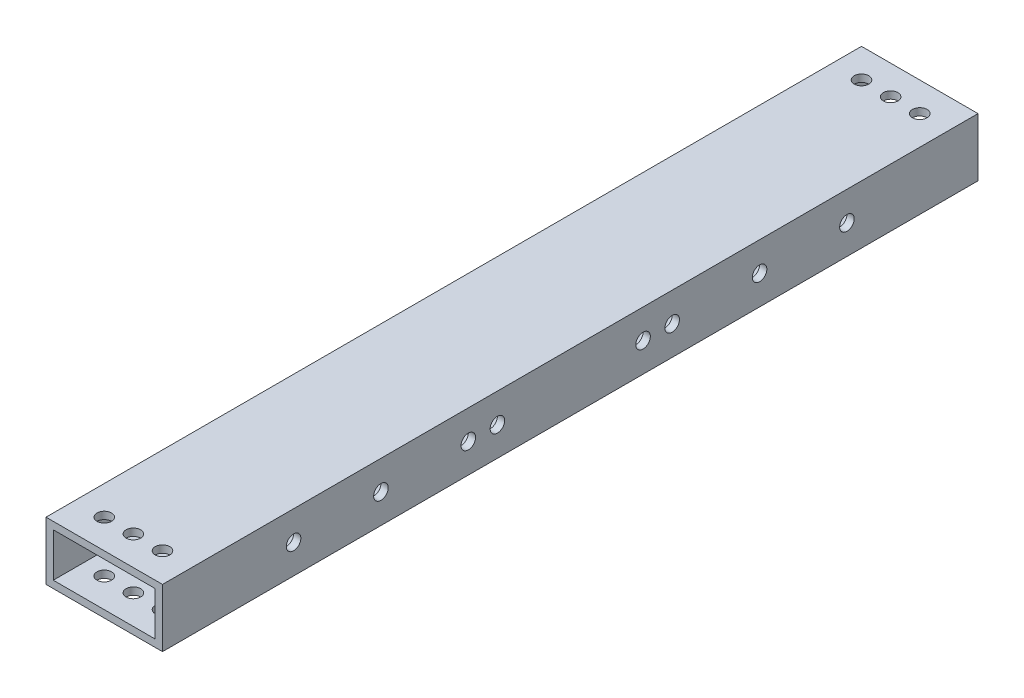
ISO-10303-21;
HEADER;
FILE_DESCRIPTION(('STEP AP214'),'2;1');
FILE_NAME('part.step','',(''),(''),'','','');
FILE_SCHEMA(('AUTOMOTIVE_DESIGN { 1 0 10303 214 1 1 1 1 }'));
ENDSEC;
DATA;
#1=APPLICATION_CONTEXT('core data for automotive mechanical design processes');
#2=APPLICATION_PROTOCOL_DEFINITION('international standard','automotive_design',2000,#1);
#3=PRODUCT_CONTEXT('',#1,'mechanical');
#4=PRODUCT('Part','Part','',(#3));
#5=PRODUCT_RELATED_PRODUCT_CATEGORY('part','',(#4));
#6=PRODUCT_DEFINITION_FORMATION('','',#4);
#7=PRODUCT_DEFINITION_CONTEXT('part definition',#1,'design');
#8=PRODUCT_DEFINITION('design','',#6,#7);
#9=PRODUCT_DEFINITION_SHAPE('','',#8);
#10=(LENGTH_UNIT() NAMED_UNIT(*) SI_UNIT(.MILLI.,.METRE.));
#11=(NAMED_UNIT(*) PLANE_ANGLE_UNIT() SI_UNIT($,.RADIAN.));
#12=(NAMED_UNIT(*) SI_UNIT($,.STERADIAN.) SOLID_ANGLE_UNIT());
#13=UNCERTAINTY_MEASURE_WITH_UNIT(LENGTH_MEASURE(1.E-05),#10,'distance_accuracy_value','');
#14=(GEOMETRIC_REPRESENTATION_CONTEXT(3) GLOBAL_UNCERTAINTY_ASSIGNED_CONTEXT((#13)) GLOBAL_UNIT_ASSIGNED_CONTEXT((#10,
#11,#12)) REPRESENTATION_CONTEXT('',''));
#15=CARTESIAN_POINT('',(0.,0.,0.));
#16=DIRECTION('',(0.,0.,1.));
#17=DIRECTION('',(1.,0.,0.));
#18=AXIS2_PLACEMENT_3D('',#15,#16,#17);
#19=CARTESIAN_POINT('',(0.,0.,355.6));
#20=DIRECTION('',(0.,0.,-1.));
#21=DIRECTION('',(-1.,0.,0.));
#22=AXIS2_PLACEMENT_3D('',#19,#20,#21);
#23=PLANE('',#22);
#24=DIRECTION('',(0.,-1.,0.));
#25=VECTOR('',#24,1.);
#26=CARTESIAN_POINT('',(0.,0.,355.6));
#27=LINE('',#26,#25);
#28=CARTESIAN_POINT('',(0.,25.4,355.6));
#29=VERTEX_POINT('',#28);
#30=CARTESIAN_POINT('',(0.,0.,355.6));
#31=VERTEX_POINT('',#30);
#32=EDGE_CURVE('E144',#29,#31,#27,.T.);
#33=ORIENTED_EDGE('',*,*,#32,.T.);
#34=DIRECTION('',(1.,0.,0.));
#35=VECTOR('',#34,1.);
#36=CARTESIAN_POINT('',(0.,0.,355.6));
#37=LINE('',#36,#35);
#38=CARTESIAN_POINT('',(50.8,0.,355.6));
#39=VERTEX_POINT('',#38);
#40=EDGE_CURVE('E147',#31,#39,#37,.T.);
#41=ORIENTED_EDGE('',*,*,#40,.T.);
#42=DIRECTION('',(0.,1.,0.));
#43=VECTOR('',#42,1.);
#44=CARTESIAN_POINT('',(50.8,0.,355.6));
#45=LINE('',#44,#43);
#46=CARTESIAN_POINT('',(50.8,25.4,355.6));
#47=VERTEX_POINT('',#46);
#48=EDGE_CURVE('E150',#39,#47,#45,.T.);
#49=ORIENTED_EDGE('',*,*,#48,.T.);
#50=DIRECTION('',(-1.,0.,0.));
#51=VECTOR('',#50,1.);
#52=CARTESIAN_POINT('',(0.,25.4,355.6));
#53=LINE('',#52,#51);
#54=EDGE_CURVE('E152',#47,#29,#53,.T.);
#55=ORIENTED_EDGE('',*,*,#54,.T.);
#56=EDGE_LOOP('',(#33,#41,#49,#55));
#57=FACE_BOUND('',#56,.T.);
#58=DIRECTION('',(0.,-1.,0.));
#59=VECTOR('',#58,1.);
#60=CARTESIAN_POINT('',(3.175,3.175,355.6));
#61=LINE('',#60,#59);
#62=CARTESIAN_POINT('',(3.175,22.225,355.6));
#63=VERTEX_POINT('',#62);
#64=CARTESIAN_POINT('',(3.175,3.175,355.6));
#65=VERTEX_POINT('',#64);
#66=EDGE_CURVE('E106',#63,#65,#61,.T.);
#67=ORIENTED_EDGE('',*,*,#66,.F.);
#68=DIRECTION('',(-1.,0.,0.));
#69=VECTOR('',#68,1.);
#70=CARTESIAN_POINT('',(3.175,22.225,355.6));
#71=LINE('',#70,#69);
#72=CARTESIAN_POINT('',(47.625,22.225,355.6));
#73=VERTEX_POINT('',#72);
#74=EDGE_CURVE('E128',#73,#63,#71,.T.);
#75=ORIENTED_EDGE('',*,*,#74,.F.);
#76=DIRECTION('',(0.,1.,0.));
#77=VECTOR('',#76,1.);
#78=CARTESIAN_POINT('',(47.625,3.175,355.6));
#79=LINE('',#78,#77);
#80=CARTESIAN_POINT('',(47.625,3.175,355.6));
#81=VERTEX_POINT('',#80);
#82=EDGE_CURVE('E126',#81,#73,#79,.T.);
#83=ORIENTED_EDGE('',*,*,#82,.F.);
#84=DIRECTION('',(1.,0.,0.));
#85=VECTOR('',#84,1.);
#86=CARTESIAN_POINT('',(3.175,3.175,355.6));
#87=LINE('',#86,#85);
#88=EDGE_CURVE('E114',#65,#81,#87,.T.);
#89=ORIENTED_EDGE('',*,*,#88,.F.);
#90=EDGE_LOOP('',(#67,#75,#83,#89));
#91=FACE_BOUND('',#90,.T.);
#92=ADVANCED_FACE('F39',(#57,#91),#23,.F.);
#93=CARTESIAN_POINT('',(0.,0.,0.));
#94=DIRECTION('',(0.,0.,-1.));
#95=DIRECTION('',(-1.,0.,0.));
#96=AXIS2_PLACEMENT_3D('',#93,#94,#95);
#97=PLANE('',#96);
#98=DIRECTION('',(0.,-1.,0.));
#99=VECTOR('',#98,1.);
#100=CARTESIAN_POINT('',(0.,0.,0.));
#101=LINE('',#100,#99);
#102=CARTESIAN_POINT('',(0.,25.4,0.));
#103=VERTEX_POINT('',#102);
#104=CARTESIAN_POINT('',(0.,0.,0.));
#105=VERTEX_POINT('',#104);
#106=EDGE_CURVE('E122',#103,#105,#101,.T.);
#107=ORIENTED_EDGE('',*,*,#106,.F.);
#108=DIRECTION('',(-1.,0.,0.));
#109=VECTOR('',#108,1.);
#110=CARTESIAN_POINT('',(0.,25.4,0.));
#111=LINE('',#110,#109);
#112=CARTESIAN_POINT('',(50.8,25.4,0.));
#113=VERTEX_POINT('',#112);
#114=EDGE_CURVE('E148',#113,#103,#111,.T.);
#115=ORIENTED_EDGE('',*,*,#114,.F.);
#116=DIRECTION('',(0.,1.,0.));
#117=VECTOR('',#116,1.);
#118=CARTESIAN_POINT('',(50.8,0.,0.));
#119=LINE('',#118,#117);
#120=CARTESIAN_POINT('',(50.8,0.,0.));
#121=VERTEX_POINT('',#120);
#122=EDGE_CURVE('E159',#121,#113,#119,.T.);
#123=ORIENTED_EDGE('',*,*,#122,.F.);
#124=DIRECTION('',(1.,0.,0.));
#125=VECTOR('',#124,1.);
#126=CARTESIAN_POINT('',(0.,0.,0.));
#127=LINE('',#126,#125);
#128=EDGE_CURVE('E157',#105,#121,#127,.T.);
#129=ORIENTED_EDGE('',*,*,#128,.F.);
#130=EDGE_LOOP('',(#107,#115,#123,#129));
#131=FACE_BOUND('',#130,.T.);
#132=DIRECTION('',(-1.,0.,0.));
#133=VECTOR('',#132,1.);
#134=CARTESIAN_POINT('',(3.175,22.225,0.));
#135=LINE('',#134,#133);
#136=CARTESIAN_POINT('',(47.625,22.225,0.));
#137=VERTEX_POINT('',#136);
#138=CARTESIAN_POINT('',(3.175,22.225,0.));
#139=VERTEX_POINT('',#138);
#140=EDGE_CURVE('E115',#137,#139,#135,.T.);
#141=ORIENTED_EDGE('',*,*,#140,.T.);
#142=DIRECTION('',(0.,-1.,0.));
#143=VECTOR('',#142,1.);
#144=CARTESIAN_POINT('',(3.175,3.175,0.));
#145=LINE('',#144,#143);
#146=CARTESIAN_POINT('',(3.175,3.175,0.));
#147=VERTEX_POINT('',#146);
#148=EDGE_CURVE('E64',#139,#147,#145,.T.);
#149=ORIENTED_EDGE('',*,*,#148,.T.);
#150=DIRECTION('',(1.,0.,0.));
#151=VECTOR('',#150,1.);
#152=CARTESIAN_POINT('',(3.175,3.175,0.));
#153=LINE('',#152,#151);
#154=CARTESIAN_POINT('',(47.625,3.175,0.));
#155=VERTEX_POINT('',#154);
#156=EDGE_CURVE('E121',#147,#155,#153,.T.);
#157=ORIENTED_EDGE('',*,*,#156,.T.);
#158=DIRECTION('',(0.,1.,0.));
#159=VECTOR('',#158,1.);
#160=CARTESIAN_POINT('',(47.625,3.175,0.));
#161=LINE('',#160,#159);
#162=EDGE_CURVE('E136',#155,#137,#161,.T.);
#163=ORIENTED_EDGE('',*,*,#162,.T.);
#164=EDGE_LOOP('',(#141,#149,#157,#163));
#165=FACE_BOUND('',#164,.T.);
#166=ADVANCED_FACE('F355',(#131,#165),#97,.T.);
#167=CARTESIAN_POINT('',(0.,0.,355.6));
#168=DIRECTION('',(1.,0.,0.));
#169=DIRECTION('',(0.,0.,-1.));
#170=AXIS2_PLACEMENT_3D('',#167,#168,#169);
#171=PLANE('',#170);
#172=CARTESIAN_POINT('',(0.,12.7000000000001,298.45));
#173=DIRECTION('',(1.,0.,0.));
#174=DIRECTION('',(0.,0.,-1.));
#175=AXIS2_PLACEMENT_3D('',#172,#173,#174);
#176=CIRCLE('',#175,3.17500000000003);
#177=CARTESIAN_POINT('',(0.,12.7000000000001,295.275));
#178=VERTEX_POINT('',#177);
#179=EDGE_CURVE('E134',#178,#178,#176,.T.);
#180=ORIENTED_EDGE('',*,*,#179,.T.);
#181=EDGE_LOOP('',(#180));
#182=FACE_BOUND('',#181,.T.);
#183=CARTESIAN_POINT('',(0.,12.7000000000001,260.35));
#184=DIRECTION('',(1.,0.,0.));
#185=DIRECTION('',(0.,0.,-1.));
#186=AXIS2_PLACEMENT_3D('',#183,#184,#185);
#187=CIRCLE('',#186,3.17499999999997);
#188=CARTESIAN_POINT('',(0.,12.7000000000001,257.175));
#189=VERTEX_POINT('',#188);
#190=EDGE_CURVE('E208',#189,#189,#187,.T.);
#191=ORIENTED_EDGE('',*,*,#190,.T.);
#192=EDGE_LOOP('',(#191));
#193=FACE_BOUND('',#192,.T.);
#194=CARTESIAN_POINT('',(0.,12.7000000000001,222.25));
#195=DIRECTION('',(1.,0.,0.));
#196=DIRECTION('',(0.,0.,-1.));
#197=AXIS2_PLACEMENT_3D('',#194,#195,#196);
#198=CIRCLE('',#197,3.175);
#199=CARTESIAN_POINT('',(0.,12.7000000000001,219.075));
#200=VERTEX_POINT('',#199);
#201=EDGE_CURVE('E203',#200,#200,#198,.T.);
#202=ORIENTED_EDGE('',*,*,#201,.T.);
#203=EDGE_LOOP('',(#202));
#204=FACE_BOUND('',#203,.T.);
#205=CARTESIAN_POINT('',(0.,12.7000000000001,146.05));
#206=DIRECTION('',(1.,0.,0.));
#207=DIRECTION('',(0.,0.,-1.));
#208=AXIS2_PLACEMENT_3D('',#205,#206,#207);
#209=CIRCLE('',#208,3.175);
#210=CARTESIAN_POINT('',(0.,12.7000000000001,142.875));
#211=VERTEX_POINT('',#210);
#212=EDGE_CURVE('E198',#211,#211,#209,.T.);
#213=ORIENTED_EDGE('',*,*,#212,.T.);
#214=EDGE_LOOP('',(#213));
#215=FACE_BOUND('',#214,.T.);
#216=CARTESIAN_POINT('',(0.,12.7000000000001,95.25));
#217=DIRECTION('',(1.,0.,0.));
#218=DIRECTION('',(0.,0.,-1.));
#219=AXIS2_PLACEMENT_3D('',#216,#217,#218);
#220=CIRCLE('',#219,3.175);
#221=CARTESIAN_POINT('',(0.,12.7000000000001,92.075));
#222=VERTEX_POINT('',#221);
#223=EDGE_CURVE('E193',#222,#222,#220,.T.);
#224=ORIENTED_EDGE('',*,*,#223,.T.);
#225=EDGE_LOOP('',(#224));
#226=FACE_BOUND('',#225,.T.);
#227=CARTESIAN_POINT('',(0.,12.7000000000001,57.15));
#228=DIRECTION('',(1.,0.,0.));
#229=DIRECTION('',(0.,0.,-1.));
#230=AXIS2_PLACEMENT_3D('',#227,#228,#229);
#231=CIRCLE('',#230,3.175);
#232=CARTESIAN_POINT('',(0.,12.7000000000001,53.975));
#233=VERTEX_POINT('',#232);
#234=EDGE_CURVE('E188',#233,#233,#231,.T.);
#235=ORIENTED_EDGE('',*,*,#234,.T.);
#236=EDGE_LOOP('',(#235));
#237=FACE_BOUND('',#236,.T.);
#238=CARTESIAN_POINT('',(0.,12.7000000000001,209.55));
#239=DIRECTION('',(1.,0.,0.));
#240=DIRECTION('',(0.,0.,-1.));
#241=AXIS2_PLACEMENT_3D('',#238,#239,#240);
#242=CIRCLE('',#241,3.17500000000003);
#243=CARTESIAN_POINT('',(0.,12.7000000000001,206.375));
#244=VERTEX_POINT('',#243);
#245=EDGE_CURVE('E183',#244,#244,#242,.T.);
#246=ORIENTED_EDGE('',*,*,#245,.T.);
#247=EDGE_LOOP('',(#246));
#248=FACE_BOUND('',#247,.T.);
#249=CARTESIAN_POINT('',(0.,12.7000000000001,133.35));
#250=DIRECTION('',(1.,0.,0.));
#251=DIRECTION('',(0.,0.,-1.));
#252=AXIS2_PLACEMENT_3D('',#249,#250,#251);
#253=CIRCLE('',#252,3.175);
#254=CARTESIAN_POINT('',(0.,12.7000000000001,130.175));
#255=VERTEX_POINT('',#254);
#256=EDGE_CURVE('E178',#255,#255,#253,.T.);
#257=ORIENTED_EDGE('',*,*,#256,.T.);
#258=EDGE_LOOP('',(#257));
#259=FACE_BOUND('',#258,.T.);
#260=ORIENTED_EDGE('',*,*,#106,.T.);
#261=DIRECTION('',(0.,0.,-1.));
#262=VECTOR('',#261,1.);
#263=CARTESIAN_POINT('',(0.,0.,355.6));
#264=LINE('',#263,#262);
#265=EDGE_CURVE('E11',#31,#105,#264,.T.);
#266=ORIENTED_EDGE('',*,*,#265,.F.);
#267=ORIENTED_EDGE('',*,*,#32,.F.);
#268=DIRECTION('',(0.,0.,-1.));
#269=VECTOR('',#268,1.);
#270=CARTESIAN_POINT('',(0.,25.4,355.6));
#271=LINE('',#270,#269);
#272=EDGE_CURVE('E154',#29,#103,#271,.T.);
#273=ORIENTED_EDGE('',*,*,#272,.T.);
#274=EDGE_LOOP('',(#260,#266,#267,#273));
#275=FACE_BOUND('',#274,.T.);
#276=ADVANCED_FACE('F41',(#182,#193,#204,#215,#226,#237,#248,#259,#275),#171,.F.);
#277=CARTESIAN_POINT('',(0.,0.,355.6));
#278=DIRECTION('',(0.,1.,0.));
#279=DIRECTION('',(0.,0.,1.));
#280=AXIS2_PLACEMENT_3D('',#277,#278,#279);
#281=PLANE('',#280);
#282=CARTESIAN_POINT('',(12.7,0.,12.7));
#283=DIRECTION('',(0.,1.,0.));
#284=DIRECTION('',(0.,0.,1.));
#285=AXIS2_PLACEMENT_3D('',#282,#283,#284);
#286=CIRCLE('',#285,3.17499999999998);
#287=CARTESIAN_POINT('',(12.7,0.,15.875));
#288=VERTEX_POINT('',#287);
#289=EDGE_CURVE('E380',#288,#288,#286,.T.);
#290=ORIENTED_EDGE('',*,*,#289,.T.);
#291=EDGE_LOOP('',(#290));
#292=FACE_BOUND('',#291,.T.);
#293=CARTESIAN_POINT('',(25.4,0.,12.7));
#294=DIRECTION('',(0.,1.,0.));
#295=DIRECTION('',(0.,0.,1.));
#296=AXIS2_PLACEMENT_3D('',#293,#294,#295);
#297=CIRCLE('',#296,3.17499999999999);
#298=CARTESIAN_POINT('',(25.4,0.,15.875));
#299=VERTEX_POINT('',#298);
#300=EDGE_CURVE('E231',#299,#299,#297,.T.);
#301=ORIENTED_EDGE('',*,*,#300,.T.);
#302=EDGE_LOOP('',(#301));
#303=FACE_BOUND('',#302,.T.);
#304=CARTESIAN_POINT('',(38.1,0.,12.7));
#305=DIRECTION('',(0.,1.,0.));
#306=DIRECTION('',(0.,0.,1.));
#307=AXIS2_PLACEMENT_3D('',#304,#305,#306);
#308=CIRCLE('',#307,3.17499999999998);
#309=CARTESIAN_POINT('',(38.1,0.,15.875));
#310=VERTEX_POINT('',#309);
#311=EDGE_CURVE('E227',#310,#310,#308,.T.);
#312=ORIENTED_EDGE('',*,*,#311,.T.);
#313=EDGE_LOOP('',(#312));
#314=FACE_BOUND('',#313,.T.);
#315=CARTESIAN_POINT('',(12.7000000000001,0.,342.9));
#316=DIRECTION('',(0.,1.,0.));
#317=DIRECTION('',(0.,0.,1.));
#318=AXIS2_PLACEMENT_3D('',#315,#316,#317);
#319=CIRCLE('',#318,3.17499999999999);
#320=CARTESIAN_POINT('',(12.7000000000001,0.,346.075));
#321=VERTEX_POINT('',#320);
#322=EDGE_CURVE('E223',#321,#321,#319,.T.);
#323=ORIENTED_EDGE('',*,*,#322,.T.);
#324=EDGE_LOOP('',(#323));
#325=FACE_BOUND('',#324,.T.);
#326=CARTESIAN_POINT('',(25.4000000000001,0.,342.9));
#327=DIRECTION('',(0.,1.,0.));
#328=DIRECTION('',(0.,0.,1.));
#329=AXIS2_PLACEMENT_3D('',#326,#327,#328);
#330=CIRCLE('',#329,3.17499999999998);
#331=CARTESIAN_POINT('',(25.4000000000001,0.,346.075));
#332=VERTEX_POINT('',#331);
#333=EDGE_CURVE('E218',#332,#332,#330,.T.);
#334=ORIENTED_EDGE('',*,*,#333,.T.);
#335=EDGE_LOOP('',(#334));
#336=FACE_BOUND('',#335,.T.);
#337=CARTESIAN_POINT('',(38.1000000000001,0.,342.9));
#338=DIRECTION('',(0.,1.,0.));
#339=DIRECTION('',(0.,0.,1.));
#340=AXIS2_PLACEMENT_3D('',#337,#338,#339);
#341=CIRCLE('',#340,3.17499999999998);
#342=CARTESIAN_POINT('',(38.1000000000001,0.,346.075));
#343=VERTEX_POINT('',#342);
#344=EDGE_CURVE('E213',#343,#343,#341,.T.);
#345=ORIENTED_EDGE('',*,*,#344,.T.);
#346=EDGE_LOOP('',(#345));
#347=FACE_BOUND('',#346,.T.);
#348=ORIENTED_EDGE('',*,*,#128,.T.);
#349=DIRECTION('',(0.,0.,-1.));
#350=VECTOR('',#349,1.);
#351=CARTESIAN_POINT('',(50.8,0.,355.6));
#352=LINE('',#351,#350);
#353=EDGE_CURVE('E48',#39,#121,#352,.T.);
#354=ORIENTED_EDGE('',*,*,#353,.F.);
#355=ORIENTED_EDGE('',*,*,#40,.F.);
#356=ORIENTED_EDGE('',*,*,#265,.T.);
#357=EDGE_LOOP('',(#348,#354,#355,#356));
#358=FACE_BOUND('',#357,.T.);
#359=ADVANCED_FACE('F372',(#292,#303,#314,#325,#336,#347,#358),#281,.F.);
#360=CARTESIAN_POINT('',(50.8,0.,355.6));
#361=DIRECTION('',(-1.,0.,0.));
#362=DIRECTION('',(0.,0.,1.));
#363=AXIS2_PLACEMENT_3D('',#360,#361,#362);
#364=PLANE('',#363);
#365=CARTESIAN_POINT('',(50.8,12.7000000000001,298.45));
#366=DIRECTION('',(-1.,0.,0.));
#367=DIRECTION('',(0.,0.,-1.));
#368=AXIS2_PLACEMENT_3D('',#365,#366,#367);
#369=CIRCLE('',#368,3.17500000000003);
#370=CARTESIAN_POINT('',(50.8,12.7000000000001,295.275));
#371=VERTEX_POINT('',#370);
#372=EDGE_CURVE('E274',#371,#371,#369,.T.);
#373=ORIENTED_EDGE('',*,*,#372,.T.);
#374=EDGE_LOOP('',(#373));
#375=FACE_BOUND('',#374,.T.);
#376=CARTESIAN_POINT('',(50.8,12.7000000000001,260.35));
#377=DIRECTION('',(-1.,0.,0.));
#378=DIRECTION('',(0.,0.,-1.));
#379=AXIS2_PLACEMENT_3D('',#376,#377,#378);
#380=CIRCLE('',#379,3.17499999999997);
#381=CARTESIAN_POINT('',(50.8,12.7000000000001,257.175));
#382=VERTEX_POINT('',#381);
#383=EDGE_CURVE('E290',#382,#382,#380,.T.);
#384=ORIENTED_EDGE('',*,*,#383,.T.);
#385=EDGE_LOOP('',(#384));
#386=FACE_BOUND('',#385,.T.);
#387=CARTESIAN_POINT('',(50.8,12.7000000000001,222.25));
#388=DIRECTION('',(-1.,0.,0.));
#389=DIRECTION('',(0.,0.,-1.));
#390=AXIS2_PLACEMENT_3D('',#387,#388,#389);
#391=CIRCLE('',#390,3.175);
#392=CARTESIAN_POINT('',(50.8,12.7000000000001,219.075));
#393=VERTEX_POINT('',#392);
#394=EDGE_CURVE('E282',#393,#393,#391,.T.);
#395=ORIENTED_EDGE('',*,*,#394,.T.);
#396=EDGE_LOOP('',(#395));
#397=FACE_BOUND('',#396,.T.);
#398=CARTESIAN_POINT('',(50.8,12.7000000000001,146.05));
#399=DIRECTION('',(-1.,0.,0.));
#400=DIRECTION('',(0.,0.,1.));
#401=AXIS2_PLACEMENT_3D('',#398,#399,#400);
#402=CIRCLE('',#401,3.175);
#403=CARTESIAN_POINT('',(50.8,12.7000000000001,149.225));
#404=VERTEX_POINT('',#403);
#405=EDGE_CURVE('E283',#404,#404,#402,.T.);
#406=ORIENTED_EDGE('',*,*,#405,.T.);
#407=EDGE_LOOP('',(#406));
#408=FACE_BOUND('',#407,.T.);
#409=CARTESIAN_POINT('',(50.8,12.7000000000001,95.25));
#410=DIRECTION('',(-1.,0.,0.));
#411=DIRECTION('',(0.,0.,1.));
#412=AXIS2_PLACEMENT_3D('',#409,#410,#411);
#413=CIRCLE('',#412,3.175);
#414=CARTESIAN_POINT('',(50.8,12.7000000000001,98.425));
#415=VERTEX_POINT('',#414);
#416=EDGE_CURVE('E278',#415,#415,#413,.T.);
#417=ORIENTED_EDGE('',*,*,#416,.T.);
#418=EDGE_LOOP('',(#417));
#419=FACE_BOUND('',#418,.T.);
#420=CARTESIAN_POINT('',(50.8,12.7000000000001,57.15));
#421=DIRECTION('',(-1.,0.,0.));
#422=DIRECTION('',(0.,0.,1.));
#423=AXIS2_PLACEMENT_3D('',#420,#421,#422);
#424=CIRCLE('',#423,3.175);
#425=CARTESIAN_POINT('',(50.8,12.7000000000001,60.325));
#426=VERTEX_POINT('',#425);
#427=EDGE_CURVE('E275',#426,#426,#424,.T.);
#428=ORIENTED_EDGE('',*,*,#427,.T.);
#429=EDGE_LOOP('',(#428));
#430=FACE_BOUND('',#429,.T.);
#431=CARTESIAN_POINT('',(50.8,12.7000000000001,209.55));
#432=DIRECTION('',(-1.,0.,0.));
#433=DIRECTION('',(0.,0.,-1.));
#434=AXIS2_PLACEMENT_3D('',#431,#432,#433);
#435=CIRCLE('',#434,3.17500000000003);
#436=CARTESIAN_POINT('',(50.8,12.7000000000001,206.375));
#437=VERTEX_POINT('',#436);
#438=EDGE_CURVE('E279',#437,#437,#435,.T.);
#439=ORIENTED_EDGE('',*,*,#438,.T.);
#440=EDGE_LOOP('',(#439));
#441=FACE_BOUND('',#440,.T.);
#442=CARTESIAN_POINT('',(50.8,12.7000000000001,133.35));
#443=DIRECTION('',(-1.,0.,0.));
#444=DIRECTION('',(0.,0.,1.));
#445=AXIS2_PLACEMENT_3D('',#442,#443,#444);
#446=CIRCLE('',#445,3.175);
#447=CARTESIAN_POINT('',(50.8,12.7000000000001,136.525));
#448=VERTEX_POINT('',#447);
#449=EDGE_CURVE('E173',#448,#448,#446,.T.);
#450=ORIENTED_EDGE('',*,*,#449,.T.);
#451=EDGE_LOOP('',(#450));
#452=FACE_BOUND('',#451,.T.);
#453=ORIENTED_EDGE('',*,*,#122,.T.);
#454=DIRECTION('',(0.,0.,-1.));
#455=VECTOR('',#454,1.);
#456=CARTESIAN_POINT('',(50.8,25.4,355.6));
#457=LINE('',#456,#455);
#458=EDGE_CURVE('E164',#47,#113,#457,.T.);
#459=ORIENTED_EDGE('',*,*,#458,.F.);
#460=ORIENTED_EDGE('',*,*,#48,.F.);
#461=ORIENTED_EDGE('',*,*,#353,.T.);
#462=EDGE_LOOP('',(#453,#459,#460,#461));
#463=FACE_BOUND('',#462,.T.);
#464=ADVANCED_FACE('F369',(#375,#386,#397,#408,#419,#430,#441,#452,#463),#364,.F.);
#465=CARTESIAN_POINT('',(0.,25.4,355.6));
#466=DIRECTION('',(0.,-1.,0.));
#467=DIRECTION('',(0.,0.,-1.));
#468=AXIS2_PLACEMENT_3D('',#465,#466,#467);
#469=PLANE('',#468);
#470=CARTESIAN_POINT('',(12.7,25.4,12.7));
#471=DIRECTION('',(0.,1.,0.));
#472=DIRECTION('',(0.,0.,1.));
#473=AXIS2_PLACEMENT_3D('',#470,#471,#472);
#474=CIRCLE('',#473,3.17499999999999);
#475=CARTESIAN_POINT('',(12.7,25.4,15.875));
#476=VERTEX_POINT('',#475);
#477=EDGE_CURVE('E677',#476,#476,#474,.T.);
#478=ORIENTED_EDGE('',*,*,#477,.F.);
#479=EDGE_LOOP('',(#478));
#480=FACE_BOUND('',#479,.T.);
#481=CARTESIAN_POINT('',(25.4,25.4,12.7));
#482=DIRECTION('',(0.,1.,0.));
#483=DIRECTION('',(0.,0.,1.));
#484=AXIS2_PLACEMENT_3D('',#481,#482,#483);
#485=CIRCLE('',#484,3.17499999999999);
#486=CARTESIAN_POINT('',(25.4,25.4,15.875));
#487=VERTEX_POINT('',#486);
#488=EDGE_CURVE('E238',#487,#487,#485,.T.);
#489=ORIENTED_EDGE('',*,*,#488,.F.);
#490=EDGE_LOOP('',(#489));
#491=FACE_BOUND('',#490,.T.);
#492=CARTESIAN_POINT('',(38.1,25.4,12.7));
#493=DIRECTION('',(0.,1.,0.));
#494=DIRECTION('',(0.,0.,1.));
#495=AXIS2_PLACEMENT_3D('',#492,#493,#494);
#496=CIRCLE('',#495,3.17499999999999);
#497=CARTESIAN_POINT('',(38.1,25.4,15.875));
#498=VERTEX_POINT('',#497);
#499=EDGE_CURVE('E235',#498,#498,#496,.T.);
#500=ORIENTED_EDGE('',*,*,#499,.F.);
#501=EDGE_LOOP('',(#500));
#502=FACE_BOUND('',#501,.T.);
#503=CARTESIAN_POINT('',(12.7000000000001,25.4,342.9));
#504=DIRECTION('',(0.,1.,0.));
#505=DIRECTION('',(0.,0.,1.));
#506=AXIS2_PLACEMENT_3D('',#503,#504,#505);
#507=CIRCLE('',#506,3.17499999999999);
#508=CARTESIAN_POINT('',(12.7000000000001,25.4,346.075));
#509=VERTEX_POINT('',#508);
#510=EDGE_CURVE('E253',#509,#509,#507,.T.);
#511=ORIENTED_EDGE('',*,*,#510,.F.);
#512=EDGE_LOOP('',(#511));
#513=FACE_BOUND('',#512,.T.);
#514=CARTESIAN_POINT('',(25.4000000000001,25.4,342.9));
#515=DIRECTION('',(0.,1.,0.));
#516=DIRECTION('',(0.,0.,1.));
#517=AXIS2_PLACEMENT_3D('',#514,#515,#516);
#518=CIRCLE('',#517,3.17499999999999);
#519=CARTESIAN_POINT('',(25.4000000000001,25.4,346.075));
#520=VERTEX_POINT('',#519);
#521=EDGE_CURVE('E260',#520,#520,#518,.T.);
#522=ORIENTED_EDGE('',*,*,#521,.F.);
#523=EDGE_LOOP('',(#522));
#524=FACE_BOUND('',#523,.T.);
#525=CARTESIAN_POINT('',(38.1000000000001,25.4,342.9));
#526=DIRECTION('',(0.,1.,0.));
#527=DIRECTION('',(0.,0.,1.));
#528=AXIS2_PLACEMENT_3D('',#525,#526,#527);
#529=CIRCLE('',#528,3.17499999999998);
#530=CARTESIAN_POINT('',(38.1000000000001,25.4,346.075));
#531=VERTEX_POINT('',#530);
#532=EDGE_CURVE('E267',#531,#531,#529,.T.);
#533=ORIENTED_EDGE('',*,*,#532,.F.);
#534=EDGE_LOOP('',(#533));
#535=FACE_BOUND('',#534,.T.);
#536=ORIENTED_EDGE('',*,*,#114,.T.);
#537=ORIENTED_EDGE('',*,*,#272,.F.);
#538=ORIENTED_EDGE('',*,*,#54,.F.);
#539=ORIENTED_EDGE('',*,*,#458,.T.);
#540=EDGE_LOOP('',(#536,#537,#538,#539));
#541=FACE_BOUND('',#540,.T.);
#542=ADVANCED_FACE('F366',(#480,#491,#502,#513,#524,#535,#541),#469,.F.);
#543=CARTESIAN_POINT('',(3.175,3.175,355.6));
#544=DIRECTION('',(1.,0.,0.));
#545=DIRECTION('',(0.,0.,-1.));
#546=AXIS2_PLACEMENT_3D('',#543,#544,#545);
#547=PLANE('',#546);
#548=CARTESIAN_POINT('',(3.175,12.7000000000001,298.45));
#549=DIRECTION('',(1.,0.,0.));
#550=DIRECTION('',(0.,0.,-1.));
#551=AXIS2_PLACEMENT_3D('',#548,#549,#550);
#552=CIRCLE('',#551,3.17500000000003);
#553=CARTESIAN_POINT('',(3.175,12.7000000000001,295.275));
#554=VERTEX_POINT('',#553);
#555=EDGE_CURVE('E207',#554,#554,#552,.T.);
#556=ORIENTED_EDGE('',*,*,#555,.F.);
#557=EDGE_LOOP('',(#556));
#558=FACE_BOUND('',#557,.T.);
#559=CARTESIAN_POINT('',(3.175,12.7000000000001,260.35));
#560=DIRECTION('',(1.,0.,0.));
#561=DIRECTION('',(0.,0.,-1.));
#562=AXIS2_PLACEMENT_3D('',#559,#560,#561);
#563=CIRCLE('',#562,3.17499999999997);
#564=CARTESIAN_POINT('',(3.175,12.7000000000001,257.175));
#565=VERTEX_POINT('',#564);
#566=EDGE_CURVE('E202',#565,#565,#563,.T.);
#567=ORIENTED_EDGE('',*,*,#566,.F.);
#568=EDGE_LOOP('',(#567));
#569=FACE_BOUND('',#568,.T.);
#570=CARTESIAN_POINT('',(3.175,12.7000000000001,222.25));
#571=DIRECTION('',(1.,0.,0.));
#572=DIRECTION('',(0.,0.,-1.));
#573=AXIS2_PLACEMENT_3D('',#570,#571,#572);
#574=CIRCLE('',#573,3.175);
#575=CARTESIAN_POINT('',(3.175,12.7000000000001,219.075));
#576=VERTEX_POINT('',#575);
#577=EDGE_CURVE('E197',#576,#576,#574,.T.);
#578=ORIENTED_EDGE('',*,*,#577,.F.);
#579=EDGE_LOOP('',(#578));
#580=FACE_BOUND('',#579,.T.);
#581=CARTESIAN_POINT('',(3.175,12.7000000000001,146.05));
#582=DIRECTION('',(1.,0.,0.));
#583=DIRECTION('',(0.,0.,-1.));
#584=AXIS2_PLACEMENT_3D('',#581,#582,#583);
#585=CIRCLE('',#584,3.175);
#586=CARTESIAN_POINT('',(3.175,12.7000000000001,142.875));
#587=VERTEX_POINT('',#586);
#588=EDGE_CURVE('E192',#587,#587,#585,.T.);
#589=ORIENTED_EDGE('',*,*,#588,.F.);
#590=EDGE_LOOP('',(#589));
#591=FACE_BOUND('',#590,.T.);
#592=CARTESIAN_POINT('',(3.175,12.7000000000001,95.25));
#593=DIRECTION('',(1.,0.,0.));
#594=DIRECTION('',(0.,0.,-1.));
#595=AXIS2_PLACEMENT_3D('',#592,#593,#594);
#596=CIRCLE('',#595,3.175);
#597=CARTESIAN_POINT('',(3.175,12.7000000000001,92.075));
#598=VERTEX_POINT('',#597);
#599=EDGE_CURVE('E187',#598,#598,#596,.T.);
#600=ORIENTED_EDGE('',*,*,#599,.F.);
#601=EDGE_LOOP('',(#600));
#602=FACE_BOUND('',#601,.T.);
#603=CARTESIAN_POINT('',(3.175,12.7000000000001,57.15));
#604=DIRECTION('',(1.,0.,0.));
#605=DIRECTION('',(0.,0.,-1.));
#606=AXIS2_PLACEMENT_3D('',#603,#604,#605);
#607=CIRCLE('',#606,3.175);
#608=CARTESIAN_POINT('',(3.175,12.7000000000001,53.975));
#609=VERTEX_POINT('',#608);
#610=EDGE_CURVE('E182',#609,#609,#607,.T.);
#611=ORIENTED_EDGE('',*,*,#610,.F.);
#612=EDGE_LOOP('',(#611));
#613=FACE_BOUND('',#612,.T.);
#614=CARTESIAN_POINT('',(3.175,12.7000000000001,209.55));
#615=DIRECTION('',(1.,0.,0.));
#616=DIRECTION('',(0.,0.,-1.));
#617=AXIS2_PLACEMENT_3D('',#614,#615,#616);
#618=CIRCLE('',#617,3.17500000000003);
#619=CARTESIAN_POINT('',(3.175,12.7000000000001,206.375));
#620=VERTEX_POINT('',#619);
#621=EDGE_CURVE('E177',#620,#620,#618,.T.);
#622=ORIENTED_EDGE('',*,*,#621,.F.);
#623=EDGE_LOOP('',(#622));
#624=FACE_BOUND('',#623,.T.);
#625=CARTESIAN_POINT('',(3.175,12.7000000000001,133.35));
#626=DIRECTION('',(1.,0.,0.));
#627=DIRECTION('',(0.,0.,-1.));
#628=AXIS2_PLACEMENT_3D('',#625,#626,#627);
#629=CIRCLE('',#628,3.175);
#630=CARTESIAN_POINT('',(3.175,12.7000000000001,130.175));
#631=VERTEX_POINT('',#630);
#632=EDGE_CURVE('E172',#631,#631,#629,.T.);
#633=ORIENTED_EDGE('',*,*,#632,.F.);
#634=EDGE_LOOP('',(#633));
#635=FACE_BOUND('',#634,.T.);
#636=ORIENTED_EDGE('',*,*,#148,.F.);
#637=DIRECTION('',(0.,0.,-1.));
#638=VECTOR('',#637,1.);
#639=CARTESIAN_POINT('',(3.175,22.225,355.6));
#640=LINE('',#639,#638);
#641=EDGE_CURVE('E110',#63,#139,#640,.T.);
#642=ORIENTED_EDGE('',*,*,#641,.F.);
#643=ORIENTED_EDGE('',*,*,#66,.T.);
#644=DIRECTION('',(0.,0.,-1.));
#645=VECTOR('',#644,1.);
#646=CARTESIAN_POINT('',(3.175,3.175,355.6));
#647=LINE('',#646,#645);
#648=EDGE_CURVE('E109',#65,#147,#647,.T.);
#649=ORIENTED_EDGE('',*,*,#648,.T.);
#650=EDGE_LOOP('',(#636,#642,#643,#649));
#651=FACE_BOUND('',#650,.T.);
#652=ADVANCED_FACE('F108',(#558,#569,#580,#591,#602,#613,#624,#635,#651),#547,.T.);
#653=CARTESIAN_POINT('',(3.175,3.175,355.6));
#654=DIRECTION('',(0.,1.,0.));
#655=DIRECTION('',(0.,0.,1.));
#656=AXIS2_PLACEMENT_3D('',#653,#654,#655);
#657=PLANE('',#656);
#658=CARTESIAN_POINT('',(12.7,3.175,12.7));
#659=DIRECTION('',(0.,1.,0.));
#660=DIRECTION('',(0.,0.,1.));
#661=AXIS2_PLACEMENT_3D('',#658,#659,#660);
#662=CIRCLE('',#661,3.17499999999999);
#663=CARTESIAN_POINT('',(12.7,3.175,15.875));
#664=VERTEX_POINT('',#663);
#665=EDGE_CURVE('E43',#664,#664,#662,.T.);
#666=ORIENTED_EDGE('',*,*,#665,.F.);
#667=EDGE_LOOP('',(#666));
#668=FACE_BOUND('',#667,.T.);
#669=CARTESIAN_POINT('',(25.4,3.175,12.7));
#670=DIRECTION('',(0.,1.,0.));
#671=DIRECTION('',(0.,0.,1.));
#672=AXIS2_PLACEMENT_3D('',#669,#670,#671);
#673=CIRCLE('',#672,3.17499999999999);
#674=CARTESIAN_POINT('',(25.4,3.175,15.875));
#675=VERTEX_POINT('',#674);
#676=EDGE_CURVE('E230',#675,#675,#673,.T.);
#677=ORIENTED_EDGE('',*,*,#676,.F.);
#678=EDGE_LOOP('',(#677));
#679=FACE_BOUND('',#678,.T.);
#680=CARTESIAN_POINT('',(38.1,3.175,12.7));
#681=DIRECTION('',(0.,1.,0.));
#682=DIRECTION('',(0.,0.,1.));
#683=AXIS2_PLACEMENT_3D('',#680,#681,#682);
#684=CIRCLE('',#683,3.17499999999999);
#685=CARTESIAN_POINT('',(38.1,3.175,15.875));
#686=VERTEX_POINT('',#685);
#687=EDGE_CURVE('E226',#686,#686,#684,.T.);
#688=ORIENTED_EDGE('',*,*,#687,.F.);
#689=EDGE_LOOP('',(#688));
#690=FACE_BOUND('',#689,.T.);
#691=CARTESIAN_POINT('',(12.7000000000001,3.175,342.9));
#692=DIRECTION('',(0.,1.,0.));
#693=DIRECTION('',(0.,0.,1.));
#694=AXIS2_PLACEMENT_3D('',#691,#692,#693);
#695=CIRCLE('',#694,3.17499999999999);
#696=CARTESIAN_POINT('',(12.7000000000001,3.175,346.075));
#697=VERTEX_POINT('',#696);
#698=EDGE_CURVE('E222',#697,#697,#695,.T.);
#699=ORIENTED_EDGE('',*,*,#698,.F.);
#700=EDGE_LOOP('',(#699));
#701=FACE_BOUND('',#700,.T.);
#702=CARTESIAN_POINT('',(25.4000000000001,3.175,342.9));
#703=DIRECTION('',(0.,1.,0.));
#704=DIRECTION('',(0.,0.,1.));
#705=AXIS2_PLACEMENT_3D('',#702,#703,#704);
#706=CIRCLE('',#705,3.17499999999999);
#707=CARTESIAN_POINT('',(25.4000000000001,3.175,346.075));
#708=VERTEX_POINT('',#707);
#709=EDGE_CURVE('E217',#708,#708,#706,.T.);
#710=ORIENTED_EDGE('',*,*,#709,.F.);
#711=EDGE_LOOP('',(#710));
#712=FACE_BOUND('',#711,.T.);
#713=CARTESIAN_POINT('',(38.1000000000001,3.175,342.9));
#714=DIRECTION('',(0.,1.,0.));
#715=DIRECTION('',(0.,0.,1.));
#716=AXIS2_PLACEMENT_3D('',#713,#714,#715);
#717=CIRCLE('',#716,3.17499999999998);
#718=CARTESIAN_POINT('',(38.1000000000001,3.175,346.075));
#719=VERTEX_POINT('',#718);
#720=EDGE_CURVE('E212',#719,#719,#717,.T.);
#721=ORIENTED_EDGE('',*,*,#720,.F.);
#722=EDGE_LOOP('',(#721));
#723=FACE_BOUND('',#722,.T.);
#724=ORIENTED_EDGE('',*,*,#156,.F.);
#725=ORIENTED_EDGE('',*,*,#648,.F.);
#726=ORIENTED_EDGE('',*,*,#88,.T.);
#727=DIRECTION('',(0.,0.,-1.));
#728=VECTOR('',#727,1.);
#729=CARTESIAN_POINT('',(47.625,3.175,355.6));
#730=LINE('',#729,#728);
#731=EDGE_CURVE('E123',#81,#155,#730,.T.);
#732=ORIENTED_EDGE('',*,*,#731,.T.);
#733=EDGE_LOOP('',(#724,#725,#726,#732));
#734=FACE_BOUND('',#733,.T.);
#735=ADVANCED_FACE('F118',(#668,#679,#690,#701,#712,#723,#734),#657,.T.);
#736=CARTESIAN_POINT('',(47.625,3.175,355.6));
#737=DIRECTION('',(-1.,0.,0.));
#738=DIRECTION('',(0.,0.,1.));
#739=AXIS2_PLACEMENT_3D('',#736,#737,#738);
#740=PLANE('',#739);
#741=CARTESIAN_POINT('',(47.625,12.7000000000001,298.45));
#742=DIRECTION('',(-1.,0.,0.));
#743=DIRECTION('',(0.,0.,1.));
#744=AXIS2_PLACEMENT_3D('',#741,#742,#743);
#745=CIRCLE('',#744,3.17500000000003);
#746=CARTESIAN_POINT('',(47.625,12.7000000000001,301.625));
#747=VERTEX_POINT('',#746);
#748=EDGE_CURVE('E204',#747,#747,#745,.T.);
#749=ORIENTED_EDGE('',*,*,#748,.F.);
#750=EDGE_LOOP('',(#749));
#751=FACE_BOUND('',#750,.T.);
#752=CARTESIAN_POINT('',(47.625,12.7000000000001,260.35));
#753=DIRECTION('',(-1.,0.,0.));
#754=DIRECTION('',(0.,0.,1.));
#755=AXIS2_PLACEMENT_3D('',#752,#753,#754);
#756=CIRCLE('',#755,3.17499999999997);
#757=CARTESIAN_POINT('',(47.625,12.7000000000001,263.525));
#758=VERTEX_POINT('',#757);
#759=EDGE_CURVE('E199',#758,#758,#756,.T.);
#760=ORIENTED_EDGE('',*,*,#759,.F.);
#761=EDGE_LOOP('',(#760));
#762=FACE_BOUND('',#761,.T.);
#763=CARTESIAN_POINT('',(47.625,12.7000000000001,222.25));
#764=DIRECTION('',(-1.,0.,0.));
#765=DIRECTION('',(0.,0.,1.));
#766=AXIS2_PLACEMENT_3D('',#763,#764,#765);
#767=CIRCLE('',#766,3.175);
#768=CARTESIAN_POINT('',(47.625,12.7000000000001,225.425));
#769=VERTEX_POINT('',#768);
#770=EDGE_CURVE('E194',#769,#769,#767,.T.);
#771=ORIENTED_EDGE('',*,*,#770,.F.);
#772=EDGE_LOOP('',(#771));
#773=FACE_BOUND('',#772,.T.);
#774=CARTESIAN_POINT('',(47.625,12.7000000000001,146.05));
#775=DIRECTION('',(-1.,0.,0.));
#776=DIRECTION('',(0.,0.,1.));
#777=AXIS2_PLACEMENT_3D('',#774,#775,#776);
#778=CIRCLE('',#777,3.175);
#779=CARTESIAN_POINT('',(47.625,12.7000000000001,149.225));
#780=VERTEX_POINT('',#779);
#781=EDGE_CURVE('E189',#780,#780,#778,.T.);
#782=ORIENTED_EDGE('',*,*,#781,.F.);
#783=EDGE_LOOP('',(#782));
#784=FACE_BOUND('',#783,.T.);
#785=CARTESIAN_POINT('',(47.625,12.7000000000001,95.25));
#786=DIRECTION('',(-1.,0.,0.));
#787=DIRECTION('',(0.,0.,1.));
#788=AXIS2_PLACEMENT_3D('',#785,#786,#787);
#789=CIRCLE('',#788,3.175);
#790=CARTESIAN_POINT('',(47.625,12.7000000000001,98.425));
#791=VERTEX_POINT('',#790);
#792=EDGE_CURVE('E184',#791,#791,#789,.T.);
#793=ORIENTED_EDGE('',*,*,#792,.F.);
#794=EDGE_LOOP('',(#793));
#795=FACE_BOUND('',#794,.T.);
#796=CARTESIAN_POINT('',(47.625,12.7000000000001,57.15));
#797=DIRECTION('',(-1.,0.,0.));
#798=DIRECTION('',(0.,0.,1.));
#799=AXIS2_PLACEMENT_3D('',#796,#797,#798);
#800=CIRCLE('',#799,3.175);
#801=CARTESIAN_POINT('',(47.625,12.7000000000001,60.325));
#802=VERTEX_POINT('',#801);
#803=EDGE_CURVE('E179',#802,#802,#800,.T.);
#804=ORIENTED_EDGE('',*,*,#803,.F.);
#805=EDGE_LOOP('',(#804));
#806=FACE_BOUND('',#805,.T.);
#807=CARTESIAN_POINT('',(47.625,12.7000000000001,209.55));
#808=DIRECTION('',(-1.,0.,0.));
#809=DIRECTION('',(0.,0.,1.));
#810=AXIS2_PLACEMENT_3D('',#807,#808,#809);
#811=CIRCLE('',#810,3.17500000000003);
#812=CARTESIAN_POINT('',(47.625,12.7000000000001,212.725));
#813=VERTEX_POINT('',#812);
#814=EDGE_CURVE('E174',#813,#813,#811,.T.);
#815=ORIENTED_EDGE('',*,*,#814,.F.);
#816=EDGE_LOOP('',(#815));
#817=FACE_BOUND('',#816,.T.);
#818=CARTESIAN_POINT('',(47.625,12.7000000000001,133.35));
#819=DIRECTION('',(-1.,0.,0.));
#820=DIRECTION('',(0.,0.,1.));
#821=AXIS2_PLACEMENT_3D('',#818,#819,#820);
#822=CIRCLE('',#821,3.175);
#823=CARTESIAN_POINT('',(47.625,12.7000000000001,136.525));
#824=VERTEX_POINT('',#823);
#825=EDGE_CURVE('E169',#824,#824,#822,.T.);
#826=ORIENTED_EDGE('',*,*,#825,.F.);
#827=EDGE_LOOP('',(#826));
#828=FACE_BOUND('',#827,.T.);
#829=ORIENTED_EDGE('',*,*,#162,.F.);
#830=ORIENTED_EDGE('',*,*,#731,.F.);
#831=ORIENTED_EDGE('',*,*,#82,.T.);
#832=DIRECTION('',(0.,0.,-1.));
#833=VECTOR('',#832,1.);
#834=CARTESIAN_POINT('',(47.625,22.225,355.6));
#835=LINE('',#834,#833);
#836=EDGE_CURVE('E56',#73,#137,#835,.T.);
#837=ORIENTED_EDGE('',*,*,#836,.T.);
#838=EDGE_LOOP('',(#829,#830,#831,#837));
#839=FACE_BOUND('',#838,.T.);
#840=ADVANCED_FACE('F408',(#751,#762,#773,#784,#795,#806,#817,#828,#839),#740,.T.);
#841=CARTESIAN_POINT('',(3.175,22.225,355.6));
#842=DIRECTION('',(0.,-1.,0.));
#843=DIRECTION('',(0.,0.,-1.));
#844=AXIS2_PLACEMENT_3D('',#841,#842,#843);
#845=PLANE('',#844);
#846=CARTESIAN_POINT('',(12.7,22.225,12.7));
#847=DIRECTION('',(0.,-1.,0.));
#848=DIRECTION('',(0.,0.,-1.));
#849=AXIS2_PLACEMENT_3D('',#846,#847,#848);
#850=CIRCLE('',#849,3.17499999999999);
#851=CARTESIAN_POINT('',(12.7,22.225,9.52500000000001));
#852=VERTEX_POINT('',#851);
#853=EDGE_CURVE('E243',#852,#852,#850,.T.);
#854=ORIENTED_EDGE('',*,*,#853,.F.);
#855=EDGE_LOOP('',(#854));
#856=FACE_BOUND('',#855,.T.);
#857=CARTESIAN_POINT('',(25.4,22.225,12.7));
#858=DIRECTION('',(0.,-1.,0.));
#859=DIRECTION('',(0.,0.,-1.));
#860=AXIS2_PLACEMENT_3D('',#857,#858,#859);
#861=CIRCLE('',#860,3.17499999999999);
#862=CARTESIAN_POINT('',(25.4,22.225,9.52500000000001));
#863=VERTEX_POINT('',#862);
#864=EDGE_CURVE('E228',#863,#863,#861,.T.);
#865=ORIENTED_EDGE('',*,*,#864,.F.);
#866=EDGE_LOOP('',(#865));
#867=FACE_BOUND('',#866,.T.);
#868=CARTESIAN_POINT('',(38.1,22.225,12.7));
#869=DIRECTION('',(0.,-1.,0.));
#870=DIRECTION('',(0.,0.,-1.));
#871=AXIS2_PLACEMENT_3D('',#868,#869,#870);
#872=CIRCLE('',#871,3.17499999999999);
#873=CARTESIAN_POINT('',(38.1,22.225,9.52500000000001));
#874=VERTEX_POINT('',#873);
#875=EDGE_CURVE('E224',#874,#874,#872,.T.);
#876=ORIENTED_EDGE('',*,*,#875,.F.);
#877=EDGE_LOOP('',(#876));
#878=FACE_BOUND('',#877,.T.);
#879=CARTESIAN_POINT('',(12.7000000000001,22.225,342.9));
#880=DIRECTION('',(0.,-1.,0.));
#881=DIRECTION('',(0.,0.,-1.));
#882=AXIS2_PLACEMENT_3D('',#879,#880,#881);
#883=CIRCLE('',#882,3.17499999999999);
#884=CARTESIAN_POINT('',(12.7000000000001,22.225,339.725));
#885=VERTEX_POINT('',#884);
#886=EDGE_CURVE('E219',#885,#885,#883,.T.);
#887=ORIENTED_EDGE('',*,*,#886,.F.);
#888=EDGE_LOOP('',(#887));
#889=FACE_BOUND('',#888,.T.);
#890=CARTESIAN_POINT('',(25.4000000000001,22.225,342.9));
#891=DIRECTION('',(0.,-1.,0.));
#892=DIRECTION('',(0.,0.,-1.));
#893=AXIS2_PLACEMENT_3D('',#890,#891,#892);
#894=CIRCLE('',#893,3.17499999999999);
#895=CARTESIAN_POINT('',(25.4000000000001,22.225,339.725));
#896=VERTEX_POINT('',#895);
#897=EDGE_CURVE('E214',#896,#896,#894,.T.);
#898=ORIENTED_EDGE('',*,*,#897,.F.);
#899=EDGE_LOOP('',(#898));
#900=FACE_BOUND('',#899,.T.);
#901=CARTESIAN_POINT('',(38.1000000000001,22.225,342.9));
#902=DIRECTION('',(0.,-1.,0.));
#903=DIRECTION('',(0.,0.,-1.));
#904=AXIS2_PLACEMENT_3D('',#901,#902,#903);
#905=CIRCLE('',#904,3.17499999999998);
#906=CARTESIAN_POINT('',(38.1000000000001,22.225,339.725));
#907=VERTEX_POINT('',#906);
#908=EDGE_CURVE('E209',#907,#907,#905,.T.);
#909=ORIENTED_EDGE('',*,*,#908,.F.);
#910=EDGE_LOOP('',(#909));
#911=FACE_BOUND('',#910,.T.);
#912=ORIENTED_EDGE('',*,*,#140,.F.);
#913=ORIENTED_EDGE('',*,*,#836,.F.);
#914=ORIENTED_EDGE('',*,*,#74,.T.);
#915=ORIENTED_EDGE('',*,*,#641,.T.);
#916=EDGE_LOOP('',(#912,#913,#914,#915));
#917=FACE_BOUND('',#916,.T.);
#918=ADVANCED_FACE('F405',(#856,#867,#878,#889,#900,#911,#917),#845,.T.);
#919=CARTESIAN_POINT('',(50.8,12.7000000000001,133.35));
#920=DIRECTION('',(-1.,0.,0.));
#921=DIRECTION('',(0.,0.,1.));
#922=AXIS2_PLACEMENT_3D('',#919,#920,#921);
#923=CYLINDRICAL_SURFACE('',#922,3.175);
#924=ORIENTED_EDGE('',*,*,#825,.T.);
#925=EDGE_LOOP('',(#924));
#926=FACE_BOUND('',#925,.T.);
#927=ORIENTED_EDGE('',*,*,#449,.F.);
#928=EDGE_LOOP('',(#927));
#929=FACE_BOUND('',#928,.T.);
#930=ADVANCED_FACE('F407',(#926,#929),#923,.F.);
#931=CARTESIAN_POINT('',(50.8,12.7000000000001,209.55));
#932=DIRECTION('',(-1.,0.,0.));
#933=DIRECTION('',(0.,0.,1.));
#934=AXIS2_PLACEMENT_3D('',#931,#932,#933);
#935=CYLINDRICAL_SURFACE('',#934,3.17500000000003);
#936=ORIENTED_EDGE('',*,*,#814,.T.);
#937=EDGE_LOOP('',(#936));
#938=FACE_BOUND('',#937,.T.);
#939=ORIENTED_EDGE('',*,*,#438,.F.);
#940=EDGE_LOOP('',(#939));
#941=FACE_BOUND('',#940,.T.);
#942=ADVANCED_FACE('F415',(#938,#941),#935,.F.);
#943=CARTESIAN_POINT('',(50.8,12.7000000000001,57.15));
#944=DIRECTION('',(-1.,0.,0.));
#945=DIRECTION('',(0.,0.,1.));
#946=AXIS2_PLACEMENT_3D('',#943,#944,#945);
#947=CYLINDRICAL_SURFACE('',#946,3.175);
#948=ORIENTED_EDGE('',*,*,#803,.T.);
#949=EDGE_LOOP('',(#948));
#950=FACE_BOUND('',#949,.T.);
#951=ORIENTED_EDGE('',*,*,#427,.F.);
#952=EDGE_LOOP('',(#951));
#953=FACE_BOUND('',#952,.T.);
#954=ADVANCED_FACE('F451',(#950,#953),#947,.F.);
#955=CARTESIAN_POINT('',(50.8,12.7000000000001,95.25));
#956=DIRECTION('',(-1.,0.,0.));
#957=DIRECTION('',(0.,0.,1.));
#958=AXIS2_PLACEMENT_3D('',#955,#956,#957);
#959=CYLINDRICAL_SURFACE('',#958,3.175);
#960=ORIENTED_EDGE('',*,*,#792,.T.);
#961=EDGE_LOOP('',(#960));
#962=FACE_BOUND('',#961,.T.);
#963=ORIENTED_EDGE('',*,*,#416,.F.);
#964=EDGE_LOOP('',(#963));
#965=FACE_BOUND('',#964,.T.);
#966=ADVANCED_FACE('F454',(#962,#965),#959,.F.);
#967=CARTESIAN_POINT('',(50.8,12.7000000000001,146.05));
#968=DIRECTION('',(-1.,0.,0.));
#969=DIRECTION('',(0.,0.,1.));
#970=AXIS2_PLACEMENT_3D('',#967,#968,#969);
#971=CYLINDRICAL_SURFACE('',#970,3.175);
#972=ORIENTED_EDGE('',*,*,#781,.T.);
#973=EDGE_LOOP('',(#972));
#974=FACE_BOUND('',#973,.T.);
#975=ORIENTED_EDGE('',*,*,#405,.F.);
#976=EDGE_LOOP('',(#975));
#977=FACE_BOUND('',#976,.T.);
#978=ADVANCED_FACE('F461',(#974,#977),#971,.F.);
#979=CARTESIAN_POINT('',(50.8,12.7000000000001,222.25));
#980=DIRECTION('',(-1.,0.,0.));
#981=DIRECTION('',(0.,0.,1.));
#982=AXIS2_PLACEMENT_3D('',#979,#980,#981);
#983=CYLINDRICAL_SURFACE('',#982,3.175);
#984=ORIENTED_EDGE('',*,*,#770,.T.);
#985=EDGE_LOOP('',(#984));
#986=FACE_BOUND('',#985,.T.);
#987=ORIENTED_EDGE('',*,*,#394,.F.);
#988=EDGE_LOOP('',(#987));
#989=FACE_BOUND('',#988,.T.);
#990=ADVANCED_FACE('F464',(#986,#989),#983,.F.);
#991=CARTESIAN_POINT('',(50.8,12.7000000000001,260.35));
#992=DIRECTION('',(-1.,0.,0.));
#993=DIRECTION('',(0.,0.,1.));
#994=AXIS2_PLACEMENT_3D('',#991,#992,#993);
#995=CYLINDRICAL_SURFACE('',#994,3.17499999999997);
#996=ORIENTED_EDGE('',*,*,#759,.T.);
#997=EDGE_LOOP('',(#996));
#998=FACE_BOUND('',#997,.T.);
#999=ORIENTED_EDGE('',*,*,#383,.F.);
#1000=EDGE_LOOP('',(#999));
#1001=FACE_BOUND('',#1000,.T.);
#1002=ADVANCED_FACE('F349',(#998,#1001),#995,.F.);
#1003=CARTESIAN_POINT('',(50.8,12.7000000000001,298.45));
#1004=DIRECTION('',(-1.,0.,0.));
#1005=DIRECTION('',(0.,0.,1.));
#1006=AXIS2_PLACEMENT_3D('',#1003,#1004,#1005);
#1007=CYLINDRICAL_SURFACE('',#1006,3.17500000000003);
#1008=ORIENTED_EDGE('',*,*,#748,.T.);
#1009=EDGE_LOOP('',(#1008));
#1010=FACE_BOUND('',#1009,.T.);
#1011=ORIENTED_EDGE('',*,*,#372,.F.);
#1012=EDGE_LOOP('',(#1011));
#1013=FACE_BOUND('',#1012,.T.);
#1014=ADVANCED_FACE('F337',(#1010,#1013),#1007,.F.);
#1015=ORIENTED_EDGE('',*,*,#632,.T.);
#1016=EDGE_LOOP('',(#1015));
#1017=FACE_BOUND('',#1016,.T.);
#1018=ORIENTED_EDGE('',*,*,#256,.F.);
#1019=EDGE_LOOP('',(#1018));
#1020=FACE_BOUND('',#1019,.T.);
#1021=ADVANCED_FACE('F352',(#1017,#1020),#923,.F.);
#1022=ORIENTED_EDGE('',*,*,#621,.T.);
#1023=EDGE_LOOP('',(#1022));
#1024=FACE_BOUND('',#1023,.T.);
#1025=ORIENTED_EDGE('',*,*,#245,.F.);
#1026=EDGE_LOOP('',(#1025));
#1027=FACE_BOUND('',#1026,.T.);
#1028=ADVANCED_FACE('F460',(#1024,#1027),#935,.F.);
#1029=ORIENTED_EDGE('',*,*,#610,.T.);
#1030=EDGE_LOOP('',(#1029));
#1031=FACE_BOUND('',#1030,.T.);
#1032=ORIENTED_EDGE('',*,*,#234,.F.);
#1033=EDGE_LOOP('',(#1032));
#1034=FACE_BOUND('',#1033,.T.);
#1035=ADVANCED_FACE('F456',(#1031,#1034),#947,.F.);
#1036=ORIENTED_EDGE('',*,*,#599,.T.);
#1037=EDGE_LOOP('',(#1036));
#1038=FACE_BOUND('',#1037,.T.);
#1039=ORIENTED_EDGE('',*,*,#223,.F.);
#1040=EDGE_LOOP('',(#1039));
#1041=FACE_BOUND('',#1040,.T.);
#1042=ADVANCED_FACE('F470',(#1038,#1041),#959,.F.);
#1043=ORIENTED_EDGE('',*,*,#588,.T.);
#1044=EDGE_LOOP('',(#1043));
#1045=FACE_BOUND('',#1044,.T.);
#1046=ORIENTED_EDGE('',*,*,#212,.F.);
#1047=EDGE_LOOP('',(#1046));
#1048=FACE_BOUND('',#1047,.T.);
#1049=ADVANCED_FACE('F466',(#1045,#1048),#971,.F.);
#1050=ORIENTED_EDGE('',*,*,#577,.T.);
#1051=EDGE_LOOP('',(#1050));
#1052=FACE_BOUND('',#1051,.T.);
#1053=ORIENTED_EDGE('',*,*,#201,.F.);
#1054=EDGE_LOOP('',(#1053));
#1055=FACE_BOUND('',#1054,.T.);
#1056=ADVANCED_FACE('F346',(#1052,#1055),#983,.F.);
#1057=ORIENTED_EDGE('',*,*,#566,.T.);
#1058=EDGE_LOOP('',(#1057));
#1059=FACE_BOUND('',#1058,.T.);
#1060=ORIENTED_EDGE('',*,*,#190,.F.);
#1061=EDGE_LOOP('',(#1060));
#1062=FACE_BOUND('',#1061,.T.);
#1063=ADVANCED_FACE('F334',(#1059,#1062),#995,.F.);
#1064=ORIENTED_EDGE('',*,*,#555,.T.);
#1065=EDGE_LOOP('',(#1064));
#1066=FACE_BOUND('',#1065,.T.);
#1067=ORIENTED_EDGE('',*,*,#179,.F.);
#1068=EDGE_LOOP('',(#1067));
#1069=FACE_BOUND('',#1068,.T.);
#1070=ADVANCED_FACE('F331',(#1066,#1069),#1007,.F.);
#1071=CARTESIAN_POINT('',(38.1000000000001,25.4,342.9));
#1072=DIRECTION('',(0.,1.,0.));
#1073=DIRECTION('',(0.,0.,1.));
#1074=AXIS2_PLACEMENT_3D('',#1071,#1072,#1073);
#1075=CYLINDRICAL_SURFACE('',#1074,3.17499999999998);
#1076=ORIENTED_EDGE('',*,*,#908,.T.);
#1077=EDGE_LOOP('',(#1076));
#1078=FACE_BOUND('',#1077,.T.);
#1079=ORIENTED_EDGE('',*,*,#532,.T.);
#1080=EDGE_LOOP('',(#1079));
#1081=FACE_BOUND('',#1080,.T.);
#1082=ADVANCED_FACE('F333',(#1078,#1081),#1075,.F.);
#1083=ORIENTED_EDGE('',*,*,#720,.T.);
#1084=EDGE_LOOP('',(#1083));
#1085=FACE_BOUND('',#1084,.T.);
#1086=ORIENTED_EDGE('',*,*,#344,.F.);
#1087=EDGE_LOOP('',(#1086));
#1088=FACE_BOUND('',#1087,.T.);
#1089=ADVANCED_FACE('F343',(#1085,#1088),#1075,.F.);
#1090=CARTESIAN_POINT('',(25.4000000000001,25.4,342.9));
#1091=DIRECTION('',(0.,1.,0.));
#1092=DIRECTION('',(0.,0.,1.));
#1093=AXIS2_PLACEMENT_3D('',#1090,#1091,#1092);
#1094=CYLINDRICAL_SURFACE('',#1093,3.17499999999999);
#1095=ORIENTED_EDGE('',*,*,#897,.T.);
#1096=EDGE_LOOP('',(#1095));
#1097=FACE_BOUND('',#1096,.T.);
#1098=ORIENTED_EDGE('',*,*,#521,.T.);
#1099=EDGE_LOOP('',(#1098));
#1100=FACE_BOUND('',#1099,.T.);
#1101=ADVANCED_FACE('F442',(#1097,#1100),#1094,.F.);
#1102=ORIENTED_EDGE('',*,*,#709,.T.);
#1103=EDGE_LOOP('',(#1102));
#1104=FACE_BOUND('',#1103,.T.);
#1105=ORIENTED_EDGE('',*,*,#333,.F.);
#1106=EDGE_LOOP('',(#1105));
#1107=FACE_BOUND('',#1106,.T.);
#1108=ADVANCED_FACE('F446',(#1104,#1107),#1094,.F.);
#1109=CARTESIAN_POINT('',(12.7000000000001,25.4,342.9));
#1110=DIRECTION('',(0.,1.,0.));
#1111=DIRECTION('',(0.,0.,1.));
#1112=AXIS2_PLACEMENT_3D('',#1109,#1110,#1111);
#1113=CYLINDRICAL_SURFACE('',#1112,3.17499999999999);
#1114=ORIENTED_EDGE('',*,*,#886,.T.);
#1115=EDGE_LOOP('',(#1114));
#1116=FACE_BOUND('',#1115,.T.);
#1117=ORIENTED_EDGE('',*,*,#510,.T.);
#1118=EDGE_LOOP('',(#1117));
#1119=FACE_BOUND('',#1118,.T.);
#1120=ADVANCED_FACE('F597',(#1116,#1119),#1113,.F.);
#1121=ORIENTED_EDGE('',*,*,#698,.T.);
#1122=EDGE_LOOP('',(#1121));
#1123=FACE_BOUND('',#1122,.T.);
#1124=ORIENTED_EDGE('',*,*,#322,.F.);
#1125=EDGE_LOOP('',(#1124));
#1126=FACE_BOUND('',#1125,.T.);
#1127=ADVANCED_FACE('F606',(#1123,#1126),#1113,.F.);
#1128=CARTESIAN_POINT('',(38.1,25.4,12.7));
#1129=DIRECTION('',(0.,1.,0.));
#1130=DIRECTION('',(0.,0.,1.));
#1131=AXIS2_PLACEMENT_3D('',#1128,#1129,#1130);
#1132=CYLINDRICAL_SURFACE('',#1131,3.17499999999999);
#1133=ORIENTED_EDGE('',*,*,#875,.T.);
#1134=EDGE_LOOP('',(#1133));
#1135=FACE_BOUND('',#1134,.T.);
#1136=ORIENTED_EDGE('',*,*,#499,.T.);
#1137=EDGE_LOOP('',(#1136));
#1138=FACE_BOUND('',#1137,.T.);
#1139=ADVANCED_FACE('F615',(#1135,#1138),#1132,.F.);
#1140=ORIENTED_EDGE('',*,*,#687,.T.);
#1141=EDGE_LOOP('',(#1140));
#1142=FACE_BOUND('',#1141,.T.);
#1143=ORIENTED_EDGE('',*,*,#311,.F.);
#1144=EDGE_LOOP('',(#1143));
#1145=FACE_BOUND('',#1144,.T.);
#1146=ADVANCED_FACE('F624',(#1142,#1145),#1132,.F.);
#1147=CARTESIAN_POINT('',(25.4,25.4,12.7));
#1148=DIRECTION('',(0.,1.,0.));
#1149=DIRECTION('',(0.,0.,1.));
#1150=AXIS2_PLACEMENT_3D('',#1147,#1148,#1149);
#1151=CYLINDRICAL_SURFACE('',#1150,3.17499999999999);
#1152=ORIENTED_EDGE('',*,*,#864,.T.);
#1153=EDGE_LOOP('',(#1152));
#1154=FACE_BOUND('',#1153,.T.);
#1155=ORIENTED_EDGE('',*,*,#488,.T.);
#1156=EDGE_LOOP('',(#1155));
#1157=FACE_BOUND('',#1156,.T.);
#1158=ADVANCED_FACE('F634',(#1154,#1157),#1151,.F.);
#1159=ORIENTED_EDGE('',*,*,#676,.T.);
#1160=EDGE_LOOP('',(#1159));
#1161=FACE_BOUND('',#1160,.T.);
#1162=ORIENTED_EDGE('',*,*,#300,.F.);
#1163=EDGE_LOOP('',(#1162));
#1164=FACE_BOUND('',#1163,.T.);
#1165=ADVANCED_FACE('F643',(#1161,#1164),#1151,.F.);
#1166=CARTESIAN_POINT('',(12.7,25.4,12.7));
#1167=DIRECTION('',(0.,1.,0.));
#1168=DIRECTION('',(0.,0.,1.));
#1169=AXIS2_PLACEMENT_3D('',#1166,#1167,#1168);
#1170=CYLINDRICAL_SURFACE('',#1169,3.17499999999999);
#1171=ORIENTED_EDGE('',*,*,#665,.T.);
#1172=EDGE_LOOP('',(#1171));
#1173=FACE_BOUND('',#1172,.T.);
#1174=ORIENTED_EDGE('',*,*,#289,.F.);
#1175=EDGE_LOOP('',(#1174));
#1176=FACE_BOUND('',#1175,.T.);
#1177=ADVANCED_FACE('F652',(#1173,#1176),#1170,.F.);
#1178=ORIENTED_EDGE('',*,*,#853,.T.);
#1179=EDGE_LOOP('',(#1178));
#1180=FACE_BOUND('',#1179,.T.);
#1181=ORIENTED_EDGE('',*,*,#477,.T.);
#1182=EDGE_LOOP('',(#1181));
#1183=FACE_BOUND('',#1182,.T.);
#1184=ADVANCED_FACE('F661',(#1180,#1183),#1170,.F.);
#1185=CLOSED_SHELL('',(#92,#166,#276,#359,#464,#542,#652,#735,#840,#918,#930,#942,#954,#966,
#978,#990,#1002,#1014,#1021,#1028,#1035,#1042,#1049,#1056,#1063,#1070,#1082,#1089,#1101,#1108,
#1120,#1127,#1139,#1146,#1158,#1165,#1177,#1184));
#1186=MANIFOLD_SOLID_BREP('B2',#1185);
#1187=ADVANCED_BREP_SHAPE_REPRESENTATION('',(#18,#1186),#14);
#1188=SHAPE_DEFINITION_REPRESENTATION(#9,#1187);
ENDSEC;
END-ISO-10303-21;
